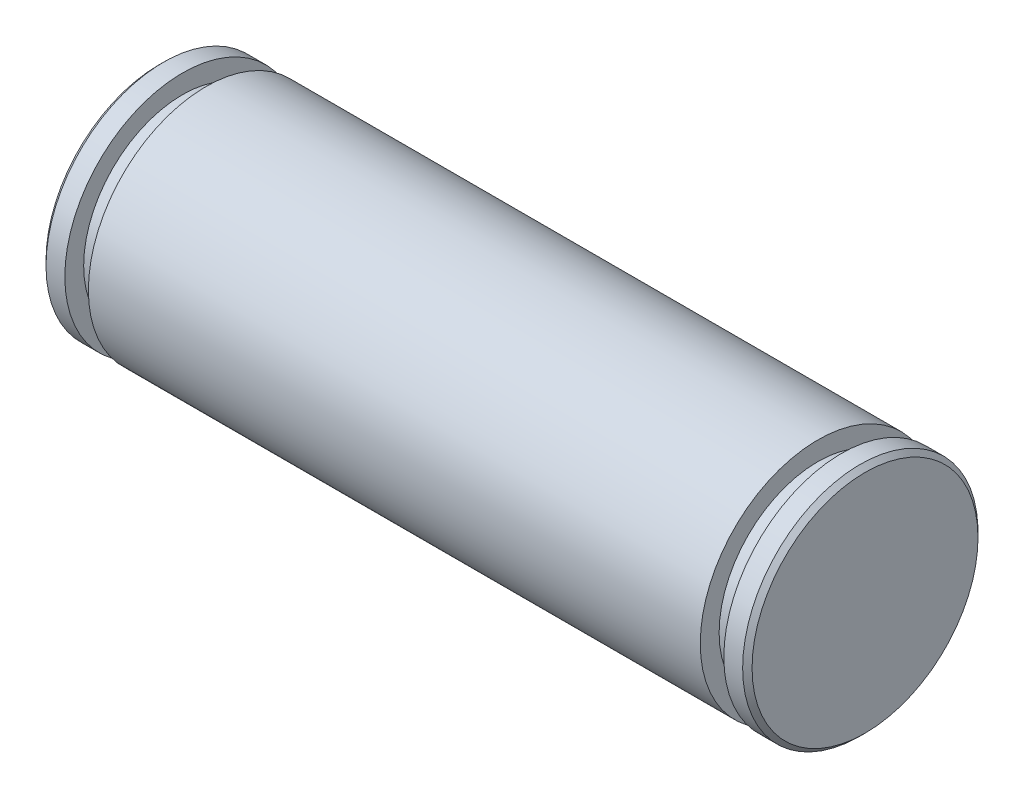
ISO-10303-21;
HEADER;
FILE_DESCRIPTION(('STEP AP214'),'2;1');
FILE_NAME('part.step','',(''),(''),'','','');
FILE_SCHEMA(('AUTOMOTIVE_DESIGN { 1 0 10303 214 1 1 1 1 }'));
ENDSEC;
DATA;
#1=APPLICATION_CONTEXT('core data for automotive mechanical design processes');
#2=APPLICATION_PROTOCOL_DEFINITION('international standard','automotive_design',2000,#1);
#3=PRODUCT_CONTEXT('',#1,'mechanical');
#4=PRODUCT('Part','Part','',(#3));
#5=PRODUCT_RELATED_PRODUCT_CATEGORY('part','',(#4));
#6=PRODUCT_DEFINITION_FORMATION('','',#4);
#7=PRODUCT_DEFINITION_CONTEXT('part definition',#1,'design');
#8=PRODUCT_DEFINITION('design','',#6,#7);
#9=PRODUCT_DEFINITION_SHAPE('','',#8);
#10=(LENGTH_UNIT() NAMED_UNIT(*) SI_UNIT(.MILLI.,.METRE.));
#11=(NAMED_UNIT(*) PLANE_ANGLE_UNIT() SI_UNIT($,.RADIAN.));
#12=(NAMED_UNIT(*) SI_UNIT($,.STERADIAN.) SOLID_ANGLE_UNIT());
#13=UNCERTAINTY_MEASURE_WITH_UNIT(LENGTH_MEASURE(1.E-05),#10,'distance_accuracy_value','');
#14=(GEOMETRIC_REPRESENTATION_CONTEXT(3) GLOBAL_UNCERTAINTY_ASSIGNED_CONTEXT((#13)) GLOBAL_UNIT_ASSIGNED_CONTEXT((#10,
#11,#12)) REPRESENTATION_CONTEXT('',''));
#15=CARTESIAN_POINT('',(0.,0.,0.));
#16=DIRECTION('',(0.,0.,1.));
#17=DIRECTION('',(1.,0.,0.));
#18=AXIS2_PLACEMENT_3D('',#15,#16,#17);
#19=CARTESIAN_POINT('',(30.,4.8,0.));
#20=DIRECTION('',(-1.,0.,0.));
#21=DIRECTION('',(0.,0.,1.));
#22=AXIS2_PLACEMENT_3D('',#19,#20,#21);
#23=PLANE('',#22);
#24=CARTESIAN_POINT('',(29.9999999999727,0.,0.));
#25=DIRECTION('',(-1.,0.,0.));
#26=DIRECTION('',(0.,0.,1.));
#27=AXIS2_PLACEMENT_3D('',#24,#25,#26);
#28=CIRCLE('',#27,4.79999999993197);
#29=CARTESIAN_POINT('',(29.9999999999727,0.,4.79999999993197));
#30=VERTEX_POINT('',#29);
#31=EDGE_CURVE('E17',#30,#30,#28,.T.);
#32=ORIENTED_EDGE('',*,*,#31,.F.);
#33=EDGE_LOOP('',(#32));
#34=FACE_BOUND('',#33,.T.);
#35=ADVANCED_FACE('F14',(#34),#23,.F.);
#36=CARTESIAN_POINT('',(0.,0.,0.));
#37=DIRECTION('',(1.,0.,0.));
#38=DIRECTION('',(0.,0.,-1.));
#39=AXIS2_PLACEMENT_3D('',#36,#37,#38);
#40=PLANE('',#39);
#41=CARTESIAN_POINT('',(5.6843418860808E-11,0.,0.));
#42=DIRECTION('',(1.,0.,0.));
#43=DIRECTION('',(0.,0.,-1.));
#44=AXIS2_PLACEMENT_3D('',#41,#42,#43);
#45=CIRCLE('',#44,4.79999999998881);
#46=CARTESIAN_POINT('',(5.6843418860808E-11,0.,-4.79999999998881));
#47=VERTEX_POINT('',#46);
#48=EDGE_CURVE('E49',#47,#47,#45,.T.);
#49=ORIENTED_EDGE('',*,*,#48,.F.);
#50=EDGE_LOOP('',(#49));
#51=FACE_BOUND('',#50,.T.);
#52=ADVANCED_FACE('F60',(#51),#40,.F.);
#53=CARTESIAN_POINT('',(29.7999999999661,0.,0.));
#54=DIRECTION('',(-1.,0.,0.));
#55=DIRECTION('',(0.,0.,1.));
#56=AXIS2_PLACEMENT_3D('',#53,#54,#55);
#57=CONICAL_SURFACE('',#56,4.99999999993861,0.785398163397448);
#58=CARTESIAN_POINT('',(29.8,0.,0.));
#59=DIRECTION('',(-1.,0.,0.));
#60=DIRECTION('',(0.,0.,1.));
#61=AXIS2_PLACEMENT_3D('',#58,#59,#60);
#62=CIRCLE('',#61,5.);
#63=CARTESIAN_POINT('',(29.8,0.,5.));
#64=VERTEX_POINT('',#63);
#65=EDGE_CURVE('E29',#64,#64,#62,.T.);
#66=ORIENTED_EDGE('',*,*,#65,.F.);
#67=EDGE_LOOP('',(#66));
#68=FACE_BOUND('',#67,.T.);
#69=ORIENTED_EDGE('',*,*,#31,.T.);
#70=EDGE_LOOP('',(#69));
#71=FACE_BOUND('',#70,.T.);
#72=ADVANCED_FACE('F57',(#68,#71),#57,.T.);
#73=CARTESIAN_POINT('',(0.200000000006639,0.,0.));
#74=DIRECTION('',(1.,0.,0.));
#75=DIRECTION('',(0.,0.,-1.));
#76=AXIS2_PLACEMENT_3D('',#73,#74,#75);
#77=CONICAL_SURFACE('',#76,4.99999999993861,0.785398163397448);
#78=CARTESIAN_POINT('',(0.200000000000006,0.,0.));
#79=DIRECTION('',(-1.,0.,0.));
#80=DIRECTION('',(0.,0.,1.));
#81=AXIS2_PLACEMENT_3D('',#78,#79,#80);
#82=CIRCLE('',#81,5.);
#83=CARTESIAN_POINT('',(0.200000000000006,0.,5.));
#84=VERTEX_POINT('',#83);
#85=EDGE_CURVE('E48',#84,#84,#82,.F.);
#86=ORIENTED_EDGE('',*,*,#85,.F.);
#87=EDGE_LOOP('',(#86));
#88=FACE_BOUND('',#87,.T.);
#89=ORIENTED_EDGE('',*,*,#48,.T.);
#90=EDGE_LOOP('',(#89));
#91=FACE_BOUND('',#90,.T.);
#92=ADVANCED_FACE('F105',(#88,#91),#77,.T.);
#93=CARTESIAN_POINT('',(-138.084352936582,0.,0.));
#94=DIRECTION('',(-1.,0.,0.));
#95=DIRECTION('',(0.,0.,1.));
#96=AXIS2_PLACEMENT_3D('',#93,#94,#95);
#97=CYLINDRICAL_SURFACE('',#96,5.);
#98=CARTESIAN_POINT('',(29.,0.,0.));
#99=DIRECTION('',(-1.,0.,0.));
#100=DIRECTION('',(0.,0.,1.));
#101=AXIS2_PLACEMENT_3D('',#98,#99,#100);
#102=CIRCLE('',#101,5.);
#103=CARTESIAN_POINT('',(29.,0.,5.));
#104=VERTEX_POINT('',#103);
#105=EDGE_CURVE('E46',#104,#104,#102,.F.);
#106=ORIENTED_EDGE('',*,*,#105,.T.);
#107=EDGE_LOOP('',(#106));
#108=FACE_BOUND('',#107,.T.);
#109=ORIENTED_EDGE('',*,*,#65,.T.);
#110=EDGE_LOOP('',(#109));
#111=FACE_BOUND('',#110,.T.);
#112=ADVANCED_FACE('F101',(#108,#111),#97,.T.);
#113=CARTESIAN_POINT('',(-138.084352936582,0.,0.));
#114=DIRECTION('',(-1.,0.,0.));
#115=DIRECTION('',(0.,0.,1.));
#116=AXIS2_PLACEMENT_3D('',#113,#114,#115);
#117=CYLINDRICAL_SURFACE('',#116,5.);
#118=ORIENTED_EDGE('',*,*,#85,.T.);
#119=EDGE_LOOP('',(#118));
#120=FACE_BOUND('',#119,.T.);
#121=CARTESIAN_POINT('',(1.,0.,0.));
#122=DIRECTION('',(-1.,0.,0.));
#123=DIRECTION('',(0.,0.,1.));
#124=AXIS2_PLACEMENT_3D('',#121,#122,#123);
#125=CIRCLE('',#124,5.);
#126=CARTESIAN_POINT('',(1.,0.,5.));
#127=VERTEX_POINT('',#126);
#128=EDGE_CURVE('E43',#127,#127,#125,.T.);
#129=ORIENTED_EDGE('',*,*,#128,.T.);
#130=EDGE_LOOP('',(#129));
#131=FACE_BOUND('',#130,.T.);
#132=ADVANCED_FACE('F97',(#120,#131),#117,.T.);
#133=CARTESIAN_POINT('',(29.,4.2,0.));
#134=DIRECTION('',(1.,0.,0.));
#135=DIRECTION('',(0.,0.,-1.));
#136=AXIS2_PLACEMENT_3D('',#133,#134,#135);
#137=PLANE('',#136);
#138=ORIENTED_EDGE('',*,*,#105,.F.);
#139=EDGE_LOOP('',(#138));
#140=FACE_BOUND('',#139,.T.);
#141=CARTESIAN_POINT('',(29.,0.,0.));
#142=DIRECTION('',(-1.,0.,0.));
#143=DIRECTION('',(0.,0.,1.));
#144=AXIS2_PLACEMENT_3D('',#141,#142,#143);
#145=CIRCLE('',#144,4.2);
#146=CARTESIAN_POINT('',(29.,0.,4.2));
#147=VERTEX_POINT('',#146);
#148=EDGE_CURVE('E40',#147,#147,#145,.T.);
#149=ORIENTED_EDGE('',*,*,#148,.F.);
#150=EDGE_LOOP('',(#149));
#151=FACE_BOUND('',#150,.T.);
#152=ADVANCED_FACE('F93',(#140,#151),#137,.F.);
#153=CARTESIAN_POINT('',(1.,5.,0.));
#154=DIRECTION('',(-1.,0.,0.));
#155=DIRECTION('',(0.,0.,1.));
#156=AXIS2_PLACEMENT_3D('',#153,#154,#155);
#157=PLANE('',#156);
#158=CARTESIAN_POINT('',(1.,0.,0.));
#159=DIRECTION('',(-1.,0.,0.));
#160=DIRECTION('',(0.,0.,1.));
#161=AXIS2_PLACEMENT_3D('',#158,#159,#160);
#162=CIRCLE('',#161,4.2);
#163=CARTESIAN_POINT('',(1.,0.,4.2));
#164=VERTEX_POINT('',#163);
#165=EDGE_CURVE('E37',#164,#164,#162,.F.);
#166=ORIENTED_EDGE('',*,*,#165,.F.);
#167=EDGE_LOOP('',(#166));
#168=FACE_BOUND('',#167,.T.);
#169=ORIENTED_EDGE('',*,*,#128,.F.);
#170=EDGE_LOOP('',(#169));
#171=FACE_BOUND('',#170,.T.);
#172=ADVANCED_FACE('F89',(#168,#171),#157,.F.);
#173=CARTESIAN_POINT('',(-138.084352936582,0.,0.));
#174=DIRECTION('',(-1.,0.,0.));
#175=DIRECTION('',(0.,0.,1.));
#176=AXIS2_PLACEMENT_3D('',#173,#174,#175);
#177=CYLINDRICAL_SURFACE('',#176,4.2);
#178=CARTESIAN_POINT('',(28.,0.,0.));
#179=DIRECTION('',(-1.,0.,0.));
#180=DIRECTION('',(0.,0.,1.));
#181=AXIS2_PLACEMENT_3D('',#178,#179,#180);
#182=CIRCLE('',#181,4.2);
#183=CARTESIAN_POINT('',(28.,0.,4.2));
#184=VERTEX_POINT('',#183);
#185=EDGE_CURVE('E34',#184,#184,#182,.F.);
#186=ORIENTED_EDGE('',*,*,#185,.T.);
#187=EDGE_LOOP('',(#186));
#188=FACE_BOUND('',#187,.T.);
#189=ORIENTED_EDGE('',*,*,#148,.T.);
#190=EDGE_LOOP('',(#189));
#191=FACE_BOUND('',#190,.T.);
#192=ADVANCED_FACE('F85',(#188,#191),#177,.T.);
#193=CARTESIAN_POINT('',(-138.084352936582,0.,0.));
#194=DIRECTION('',(-1.,0.,0.));
#195=DIRECTION('',(0.,0.,1.));
#196=AXIS2_PLACEMENT_3D('',#193,#194,#195);
#197=CYLINDRICAL_SURFACE('',#196,4.2);
#198=ORIENTED_EDGE('',*,*,#165,.T.);
#199=EDGE_LOOP('',(#198));
#200=FACE_BOUND('',#199,.T.);
#201=CARTESIAN_POINT('',(2.,0.,0.));
#202=DIRECTION('',(-1.,0.,0.));
#203=DIRECTION('',(0.,0.,1.));
#204=AXIS2_PLACEMENT_3D('',#201,#202,#203);
#205=CIRCLE('',#204,4.2);
#206=CARTESIAN_POINT('',(2.,0.,4.2));
#207=VERTEX_POINT('',#206);
#208=EDGE_CURVE('E26',#207,#207,#205,.T.);
#209=ORIENTED_EDGE('',*,*,#208,.T.);
#210=EDGE_LOOP('',(#209));
#211=FACE_BOUND('',#210,.T.);
#212=ADVANCED_FACE('F81',(#200,#211),#197,.T.);
#213=CARTESIAN_POINT('',(28.,5.,0.));
#214=DIRECTION('',(-1.,0.,0.));
#215=DIRECTION('',(0.,0.,1.));
#216=AXIS2_PLACEMENT_3D('',#213,#214,#215);
#217=PLANE('',#216);
#218=ORIENTED_EDGE('',*,*,#185,.F.);
#219=EDGE_LOOP('',(#218));
#220=FACE_BOUND('',#219,.T.);
#221=CARTESIAN_POINT('',(28.,0.,0.));
#222=DIRECTION('',(-1.,0.,0.));
#223=DIRECTION('',(0.,0.,1.));
#224=AXIS2_PLACEMENT_3D('',#221,#222,#223);
#225=CIRCLE('',#224,5.);
#226=CARTESIAN_POINT('',(28.,0.,5.));
#227=VERTEX_POINT('',#226);
#228=EDGE_CURVE('E21',#227,#227,#225,.T.);
#229=ORIENTED_EDGE('',*,*,#228,.F.);
#230=EDGE_LOOP('',(#229));
#231=FACE_BOUND('',#230,.T.);
#232=ADVANCED_FACE('F74',(#220,#231),#217,.F.);
#233=CARTESIAN_POINT('',(2.,4.2,0.));
#234=DIRECTION('',(1.,0.,0.));
#235=DIRECTION('',(0.,0.,-1.));
#236=AXIS2_PLACEMENT_3D('',#233,#234,#235);
#237=PLANE('',#236);
#238=CARTESIAN_POINT('',(2.,0.,0.));
#239=DIRECTION('',(-1.,0.,0.));
#240=DIRECTION('',(0.,0.,1.));
#241=AXIS2_PLACEMENT_3D('',#238,#239,#240);
#242=CIRCLE('',#241,5.);
#243=CARTESIAN_POINT('',(2.,0.,5.));
#244=VERTEX_POINT('',#243);
#245=EDGE_CURVE('E10',#244,#244,#242,.F.);
#246=ORIENTED_EDGE('',*,*,#245,.F.);
#247=EDGE_LOOP('',(#246));
#248=FACE_BOUND('',#247,.T.);
#249=ORIENTED_EDGE('',*,*,#208,.F.);
#250=EDGE_LOOP('',(#249));
#251=FACE_BOUND('',#250,.T.);
#252=ADVANCED_FACE('F68',(#248,#251),#237,.F.);
#253=CARTESIAN_POINT('',(-138.084352936582,0.,0.));
#254=DIRECTION('',(-1.,0.,0.));
#255=DIRECTION('',(0.,0.,1.));
#256=AXIS2_PLACEMENT_3D('',#253,#254,#255);
#257=CYLINDRICAL_SURFACE('',#256,5.);
#258=ORIENTED_EDGE('',*,*,#245,.T.);
#259=EDGE_LOOP('',(#258));
#260=FACE_BOUND('',#259,.T.);
#261=ORIENTED_EDGE('',*,*,#228,.T.);
#262=EDGE_LOOP('',(#261));
#263=FACE_BOUND('',#262,.T.);
#264=ADVANCED_FACE('F66',(#260,#263),#257,.T.);
#265=CLOSED_SHELL('',(#35,#52,#72,#92,#112,#132,#152,#172,#192,#212,#232,#252,#264));
#266=MANIFOLD_SOLID_BREP('B1',#265);
#267=ADVANCED_BREP_SHAPE_REPRESENTATION('',(#18,#266),#14);
#268=SHAPE_DEFINITION_REPRESENTATION(#9,#267);
ENDSEC;
END-ISO-10303-21;
